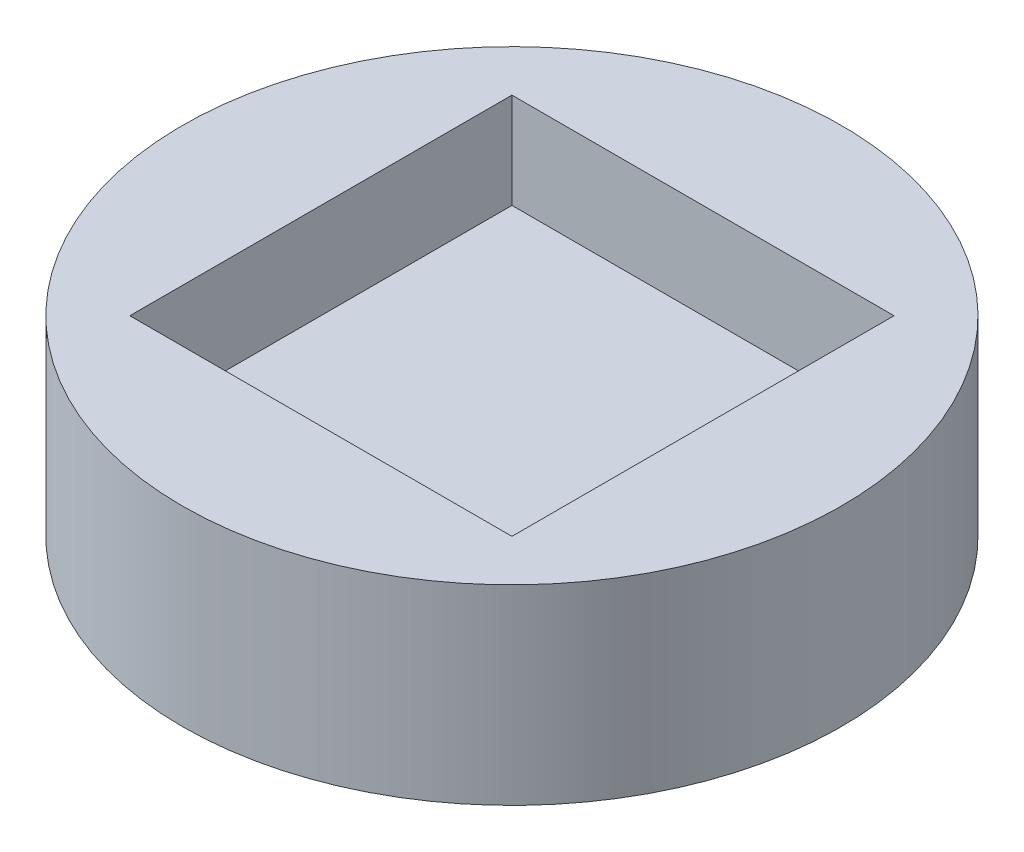
ISO-10303-21;
HEADER;
FILE_DESCRIPTION(('STEP AP214'),'2;1');
FILE_NAME('part.step','',(''),(''),'','','');
FILE_SCHEMA(('AUTOMOTIVE_DESIGN { 1 0 10303 214 1 1 1 1 }'));
ENDSEC;
DATA;
#1=APPLICATION_CONTEXT('core data for automotive mechanical design processes');
#2=APPLICATION_PROTOCOL_DEFINITION('international standard','automotive_design',2000,#1);
#3=PRODUCT_CONTEXT('',#1,'mechanical');
#4=PRODUCT('Part','Part','',(#3));
#5=PRODUCT_RELATED_PRODUCT_CATEGORY('part','',(#4));
#6=PRODUCT_DEFINITION_FORMATION('','',#4);
#7=PRODUCT_DEFINITION_CONTEXT('part definition',#1,'design');
#8=PRODUCT_DEFINITION('design','',#6,#7);
#9=PRODUCT_DEFINITION_SHAPE('','',#8);
#10=(LENGTH_UNIT() NAMED_UNIT(*) SI_UNIT(.MILLI.,.METRE.));
#11=(NAMED_UNIT(*) PLANE_ANGLE_UNIT() SI_UNIT($,.RADIAN.));
#12=(NAMED_UNIT(*) SI_UNIT($,.STERADIAN.) SOLID_ANGLE_UNIT());
#13=UNCERTAINTY_MEASURE_WITH_UNIT(LENGTH_MEASURE(1.E-05),#10,'distance_accuracy_value','');
#14=(GEOMETRIC_REPRESENTATION_CONTEXT(3) GLOBAL_UNCERTAINTY_ASSIGNED_CONTEXT((#13)) GLOBAL_UNIT_ASSIGNED_CONTEXT((#10,
#11,#12)) REPRESENTATION_CONTEXT('',''));
#15=CARTESIAN_POINT('',(0.,0.,0.));
#16=DIRECTION('',(0.,0.,1.));
#17=DIRECTION('',(1.,0.,0.));
#18=AXIS2_PLACEMENT_3D('',#15,#16,#17);
#19=CARTESIAN_POINT('',(0.,2.,0.));
#20=DIRECTION('',(0.,-1.,0.));
#21=DIRECTION('',(0.,0.,-1.));
#22=AXIS2_PLACEMENT_3D('',#19,#20,#21);
#23=CYLINDRICAL_SURFACE('',#22,3.45);
#24=CARTESIAN_POINT('',(0.,2.,0.));
#25=DIRECTION('',(0.,1.,0.));
#26=DIRECTION('',(0.,0.,1.));
#27=AXIS2_PLACEMENT_3D('',#24,#25,#26);
#28=CIRCLE('',#27,3.45);
#29=CARTESIAN_POINT('',(0.,2.,3.45));
#30=VERTEX_POINT('',#29);
#31=EDGE_CURVE('E11',#30,#30,#28,.T.);
#32=ORIENTED_EDGE('',*,*,#31,.F.);
#33=EDGE_LOOP('',(#32));
#34=FACE_BOUND('',#33,.T.);
#35=CARTESIAN_POINT('',(0.,0.,0.));
#36=DIRECTION('',(0.,1.,0.));
#37=DIRECTION('',(0.,0.,1.));
#38=AXIS2_PLACEMENT_3D('',#35,#36,#37);
#39=CIRCLE('',#38,3.45);
#40=CARTESIAN_POINT('',(0.,0.,3.45));
#41=VERTEX_POINT('',#40);
#42=EDGE_CURVE('E42',#41,#41,#39,.T.);
#43=ORIENTED_EDGE('',*,*,#42,.T.);
#44=EDGE_LOOP('',(#43));
#45=FACE_BOUND('',#44,.T.);
#46=ADVANCED_FACE('F39',(#34,#45),#23,.T.);
#47=CARTESIAN_POINT('',(0.,2.,0.));
#48=DIRECTION('',(0.,1.,0.));
#49=DIRECTION('',(0.,0.,1.));
#50=AXIS2_PLACEMENT_3D('',#47,#48,#49);
#51=PLANE('',#50);
#52=DIRECTION('',(0.,0.,1.));
#53=VECTOR('',#52,1.);
#54=CARTESIAN_POINT('',(-2.,2.,-2.));
#55=LINE('',#54,#53);
#56=CARTESIAN_POINT('',(-2.,2.,-2.));
#57=VERTEX_POINT('',#56);
#58=CARTESIAN_POINT('',(-2.,2.,2.));
#59=VERTEX_POINT('',#58);
#60=EDGE_CURVE('E54',#57,#59,#55,.T.);
#61=ORIENTED_EDGE('',*,*,#60,.F.);
#62=DIRECTION('',(-1.,0.,0.));
#63=VECTOR('',#62,1.);
#64=CARTESIAN_POINT('',(2.,2.,-2.));
#65=LINE('',#64,#63);
#66=CARTESIAN_POINT('',(2.,2.,-2.));
#67=VERTEX_POINT('',#66);
#68=EDGE_CURVE('E109',#67,#57,#65,.T.);
#69=ORIENTED_EDGE('',*,*,#68,.F.);
#70=DIRECTION('',(0.,0.,-1.));
#71=VECTOR('',#70,1.);
#72=CARTESIAN_POINT('',(2.,2.,-2.));
#73=LINE('',#72,#71);
#74=CARTESIAN_POINT('',(2.,2.,2.));
#75=VERTEX_POINT('',#74);
#76=EDGE_CURVE('E118',#75,#67,#73,.T.);
#77=ORIENTED_EDGE('',*,*,#76,.F.);
#78=DIRECTION('',(1.,0.,0.));
#79=VECTOR('',#78,1.);
#80=CARTESIAN_POINT('',(2.,2.,2.));
#81=LINE('',#80,#79);
#82=EDGE_CURVE('E89',#59,#75,#81,.T.);
#83=ORIENTED_EDGE('',*,*,#82,.F.);
#84=EDGE_LOOP('',(#61,#69,#77,#83));
#85=FACE_BOUND('',#84,.T.);
#86=ORIENTED_EDGE('',*,*,#31,.T.);
#87=EDGE_LOOP('',(#86));
#88=FACE_BOUND('',#87,.T.);
#89=ADVANCED_FACE('F129',(#85,#88),#51,.T.);
#90=CARTESIAN_POINT('',(0.,0.,0.));
#91=DIRECTION('',(0.,1.,0.));
#92=DIRECTION('',(0.,0.,1.));
#93=AXIS2_PLACEMENT_3D('',#90,#91,#92);
#94=PLANE('',#93);
#95=ORIENTED_EDGE('',*,*,#42,.F.);
#96=EDGE_LOOP('',(#95));
#97=FACE_BOUND('',#96,.T.);
#98=ADVANCED_FACE('F141',(#97),#94,.F.);
#99=CARTESIAN_POINT('',(-2.,1.,-2.));
#100=DIRECTION('',(-1.,0.,0.));
#101=DIRECTION('',(0.,0.,1.));
#102=AXIS2_PLACEMENT_3D('',#99,#100,#101);
#103=PLANE('',#102);
#104=ORIENTED_EDGE('',*,*,#60,.T.);
#105=DIRECTION('',(0.,1.,0.));
#106=VECTOR('',#105,1.);
#107=CARTESIAN_POINT('',(-2.,1.,2.));
#108=LINE('',#107,#106);
#109=CARTESIAN_POINT('',(-2.,1.,2.));
#110=VERTEX_POINT('',#109);
#111=EDGE_CURVE('E77',#110,#59,#108,.T.);
#112=ORIENTED_EDGE('',*,*,#111,.F.);
#113=DIRECTION('',(0.,0.,1.));
#114=VECTOR('',#113,1.);
#115=CARTESIAN_POINT('',(-2.,1.,-2.));
#116=LINE('',#115,#114);
#117=CARTESIAN_POINT('',(-2.,1.,-2.));
#118=VERTEX_POINT('',#117);
#119=EDGE_CURVE('E105',#118,#110,#116,.T.);
#120=ORIENTED_EDGE('',*,*,#119,.F.);
#121=DIRECTION('',(0.,1.,0.));
#122=VECTOR('',#121,1.);
#123=CARTESIAN_POINT('',(-2.,1.,-2.));
#124=LINE('',#123,#122);
#125=EDGE_CURVE('E62',#118,#57,#124,.T.);
#126=ORIENTED_EDGE('',*,*,#125,.T.);
#127=EDGE_LOOP('',(#104,#112,#120,#126));
#128=FACE_BOUND('',#127,.T.);
#129=ADVANCED_FACE('F134',(#128),#103,.F.);
#130=CARTESIAN_POINT('',(2.,1.,-2.));
#131=DIRECTION('',(0.,0.,-1.));
#132=DIRECTION('',(-1.,0.,0.));
#133=AXIS2_PLACEMENT_3D('',#130,#131,#132);
#134=PLANE('',#133);
#135=ORIENTED_EDGE('',*,*,#68,.T.);
#136=ORIENTED_EDGE('',*,*,#125,.F.);
#137=DIRECTION('',(-1.,0.,0.));
#138=VECTOR('',#137,1.);
#139=CARTESIAN_POINT('',(2.,1.,-2.));
#140=LINE('',#139,#138);
#141=CARTESIAN_POINT('',(2.,1.,-2.));
#142=VERTEX_POINT('',#141);
#143=EDGE_CURVE('E102',#142,#118,#140,.T.);
#144=ORIENTED_EDGE('',*,*,#143,.F.);
#145=DIRECTION('',(0.,1.,0.));
#146=VECTOR('',#145,1.);
#147=CARTESIAN_POINT('',(2.,1.,-2.));
#148=LINE('',#147,#146);
#149=EDGE_CURVE('E94',#142,#67,#148,.T.);
#150=ORIENTED_EDGE('',*,*,#149,.T.);
#151=EDGE_LOOP('',(#135,#136,#144,#150));
#152=FACE_BOUND('',#151,.T.);
#153=ADVANCED_FACE('F132',(#152),#134,.F.);
#154=CARTESIAN_POINT('',(2.,1.,-2.));
#155=DIRECTION('',(1.,0.,0.));
#156=DIRECTION('',(0.,0.,-1.));
#157=AXIS2_PLACEMENT_3D('',#154,#155,#156);
#158=PLANE('',#157);
#159=ORIENTED_EDGE('',*,*,#76,.T.);
#160=ORIENTED_EDGE('',*,*,#149,.F.);
#161=DIRECTION('',(0.,0.,-1.));
#162=VECTOR('',#161,1.);
#163=CARTESIAN_POINT('',(2.,1.,-2.));
#164=LINE('',#163,#162);
#165=CARTESIAN_POINT('',(2.,1.,2.));
#166=VERTEX_POINT('',#165);
#167=EDGE_CURVE('E97',#166,#142,#164,.T.);
#168=ORIENTED_EDGE('',*,*,#167,.F.);
#169=DIRECTION('',(0.,1.,0.));
#170=VECTOR('',#169,1.);
#171=CARTESIAN_POINT('',(2.,1.,2.));
#172=LINE('',#171,#170);
#173=EDGE_CURVE('E82',#166,#75,#172,.T.);
#174=ORIENTED_EDGE('',*,*,#173,.T.);
#175=EDGE_LOOP('',(#159,#160,#168,#174));
#176=FACE_BOUND('',#175,.T.);
#177=ADVANCED_FACE('F98',(#176),#158,.F.);
#178=CARTESIAN_POINT('',(2.,1.,2.));
#179=DIRECTION('',(0.,0.,1.));
#180=DIRECTION('',(1.,0.,0.));
#181=AXIS2_PLACEMENT_3D('',#178,#179,#180);
#182=PLANE('',#181);
#183=ORIENTED_EDGE('',*,*,#82,.T.);
#184=ORIENTED_EDGE('',*,*,#173,.F.);
#185=DIRECTION('',(1.,0.,0.));
#186=VECTOR('',#185,1.);
#187=CARTESIAN_POINT('',(2.,1.,2.));
#188=LINE('',#187,#186);
#189=EDGE_CURVE('E86',#110,#166,#188,.T.);
#190=ORIENTED_EDGE('',*,*,#189,.F.);
#191=ORIENTED_EDGE('',*,*,#111,.T.);
#192=EDGE_LOOP('',(#183,#184,#190,#191));
#193=FACE_BOUND('',#192,.T.);
#194=ADVANCED_FACE('F84',(#193),#182,.F.);
#195=CARTESIAN_POINT('',(0.,1.,0.));
#196=DIRECTION('',(0.,-1.,0.));
#197=DIRECTION('',(0.,0.,-1.));
#198=AXIS2_PLACEMENT_3D('',#195,#196,#197);
#199=PLANE('',#198);
#200=ORIENTED_EDGE('',*,*,#119,.T.);
#201=ORIENTED_EDGE('',*,*,#189,.T.);
#202=ORIENTED_EDGE('',*,*,#167,.T.);
#203=ORIENTED_EDGE('',*,*,#143,.T.);
#204=EDGE_LOOP('',(#200,#201,#202,#203));
#205=FACE_BOUND('',#204,.T.);
#206=ADVANCED_FACE('F104',(#205),#199,.F.);
#207=CLOSED_SHELL('',(#46,#89,#98,#129,#153,#177,#194,#206));
#208=MANIFOLD_SOLID_BREP('B2',#207);
#209=ADVANCED_BREP_SHAPE_REPRESENTATION('',(#18,#208),#14);
#210=SHAPE_DEFINITION_REPRESENTATION(#9,#209);
ENDSEC;
END-ISO-10303-21;
